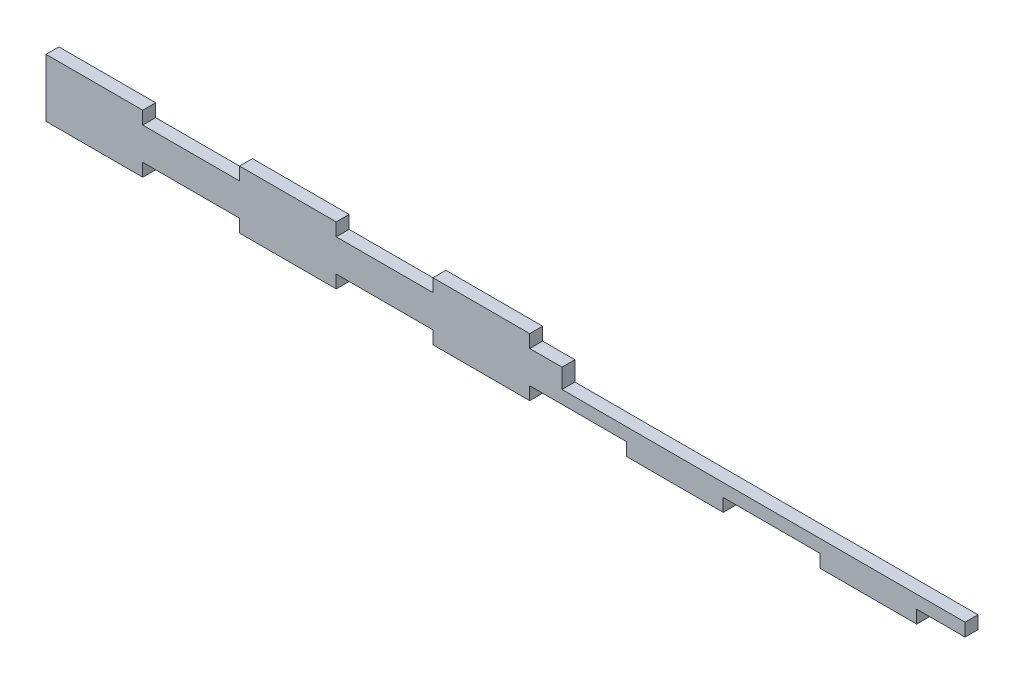
ISO-10303-21;
HEADER;
FILE_DESCRIPTION(('STEP AP214'),'2;1');
FILE_NAME('part.step','',(''),(''),'','','');
FILE_SCHEMA(('AUTOMOTIVE_DESIGN { 1 0 10303 214 1 1 1 1 }'));
ENDSEC;
DATA;
#1=APPLICATION_CONTEXT('core data for automotive mechanical design processes');
#2=APPLICATION_PROTOCOL_DEFINITION('international standard','automotive_design',2000,#1);
#3=PRODUCT_CONTEXT('',#1,'mechanical');
#4=PRODUCT('Part','Part','',(#3));
#5=PRODUCT_RELATED_PRODUCT_CATEGORY('part','',(#4));
#6=PRODUCT_DEFINITION_FORMATION('','',#4);
#7=PRODUCT_DEFINITION_CONTEXT('part definition',#1,'design');
#8=PRODUCT_DEFINITION('design','',#6,#7);
#9=PRODUCT_DEFINITION_SHAPE('','',#8);
#10=(LENGTH_UNIT() NAMED_UNIT(*) SI_UNIT(.MILLI.,.METRE.));
#11=(NAMED_UNIT(*) PLANE_ANGLE_UNIT() SI_UNIT($,.RADIAN.));
#12=(NAMED_UNIT(*) SI_UNIT($,.STERADIAN.) SOLID_ANGLE_UNIT());
#13=UNCERTAINTY_MEASURE_WITH_UNIT(LENGTH_MEASURE(1.E-05),#10,'distance_accuracy_value','');
#14=(GEOMETRIC_REPRESENTATION_CONTEXT(3) GLOBAL_UNCERTAINTY_ASSIGNED_CONTEXT((#13)) GLOBAL_UNIT_ASSIGNED_CONTEXT((#10,
#11,#12)) REPRESENTATION_CONTEXT('',''));
#15=CARTESIAN_POINT('',(0.,0.,0.));
#16=DIRECTION('',(0.,0.,1.));
#17=DIRECTION('',(1.,0.,0.));
#18=AXIS2_PLACEMENT_3D('',#15,#16,#17);
#19=CARTESIAN_POINT('',(15.,5.00000000000004,2.));
#20=DIRECTION('',(0.,-1.,0.));
#21=DIRECTION('',(1.,0.,0.));
#22=AXIS2_PLACEMENT_3D('',#19,#20,#21);
#23=PLANE('',#22);
#24=DIRECTION('',(-1.,0.,0.));
#25=VECTOR('',#24,1.);
#26=CARTESIAN_POINT('',(15.,5.00000000000004,2.));
#27=LINE('',#26,#25);
#28=CARTESIAN_POINT('',(25.,4.99999999999999,2.));
#29=VERTEX_POINT('',#28);
#30=CARTESIAN_POINT('',(15.,5.00000000000004,2.));
#31=VERTEX_POINT('',#30);
#32=EDGE_CURVE('E171',#29,#31,#27,.T.);
#33=ORIENTED_EDGE('',*,*,#32,.F.);
#34=DIRECTION('',(0.,0.,1.));
#35=VECTOR('',#34,1.);
#36=CARTESIAN_POINT('',(25.,5.00000000000001,-2.001));
#37=LINE('',#36,#35);
#38=CARTESIAN_POINT('',(25.,5.,-2.));
#39=VERTEX_POINT('',#38);
#40=EDGE_CURVE('E510',#39,#29,#37,.T.);
#41=ORIENTED_EDGE('',*,*,#40,.F.);
#42=DIRECTION('',(-1.,0.,0.));
#43=VECTOR('',#42,1.);
#44=CARTESIAN_POINT('',(15.,5.00000000000004,-2.));
#45=LINE('',#44,#43);
#46=CARTESIAN_POINT('',(15.,5.00000000000004,-2.));
#47=VERTEX_POINT('',#46);
#48=EDGE_CURVE('E282',#39,#47,#45,.T.);
#49=ORIENTED_EDGE('',*,*,#48,.T.);
#50=DIRECTION('',(0.,0.,-1.));
#51=VECTOR('',#50,1.);
#52=CARTESIAN_POINT('',(15.,5.00000000000004,2.));
#53=LINE('',#52,#51);
#54=EDGE_CURVE('E11',#31,#47,#53,.T.);
#55=ORIENTED_EDGE('',*,*,#54,.F.);
#56=EDGE_LOOP('',(#33,#41,#49,#55));
#57=FACE_BOUND('',#56,.T.);
#58=ADVANCED_FACE('F42',(#57),#23,.F.);
#59=CARTESIAN_POINT('',(15.,5.00000000000004,2.));
#60=DIRECTION('',(-1.,0.,0.));
#61=DIRECTION('',(0.,0.,1.));
#62=AXIS2_PLACEMENT_3D('',#59,#60,#61);
#63=PLANE('',#62);
#64=DIRECTION('',(0.,1.,0.));
#65=VECTOR('',#64,1.);
#66=CARTESIAN_POINT('',(15.,5.00000000000004,-2.));
#67=LINE('',#66,#65);
#68=CARTESIAN_POINT('',(15.,8.99999999999996,-2.));
#69=VERTEX_POINT('',#68);
#70=EDGE_CURVE('E284',#47,#69,#67,.T.);
#71=ORIENTED_EDGE('',*,*,#70,.T.);
#72=DIRECTION('',(0.,0.,-1.));
#73=VECTOR('',#72,1.);
#74=CARTESIAN_POINT('',(15.,8.99999999999996,2.));
#75=LINE('',#74,#73);
#76=CARTESIAN_POINT('',(15.,8.99999999999996,2.));
#77=VERTEX_POINT('',#76);
#78=EDGE_CURVE('E49',#77,#69,#75,.T.);
#79=ORIENTED_EDGE('',*,*,#78,.F.);
#80=DIRECTION('',(0.,1.,0.));
#81=VECTOR('',#80,1.);
#82=CARTESIAN_POINT('',(15.,5.00000000000004,2.));
#83=LINE('',#82,#81);
#84=EDGE_CURVE('E500',#31,#77,#83,.T.);
#85=ORIENTED_EDGE('',*,*,#84,.F.);
#86=ORIENTED_EDGE('',*,*,#54,.T.);
#87=EDGE_LOOP('',(#71,#79,#85,#86));
#88=FACE_BOUND('',#87,.T.);
#89=ADVANCED_FACE('F505',(#88),#63,.F.);
#90=CARTESIAN_POINT('',(-15.,8.99999999999996,2.));
#91=DIRECTION('',(0.,-1.,0.));
#92=DIRECTION('',(0.,0.,-1.));
#93=AXIS2_PLACEMENT_3D('',#90,#91,#92);
#94=PLANE('',#93);
#95=DIRECTION('',(-1.,0.,0.));
#96=VECTOR('',#95,1.);
#97=CARTESIAN_POINT('',(-15.,8.99999999999996,-2.));
#98=LINE('',#97,#96);
#99=CARTESIAN_POINT('',(-15.,8.99999999999996,-2.));
#100=VERTEX_POINT('',#99);
#101=EDGE_CURVE('E287',#69,#100,#98,.T.);
#102=ORIENTED_EDGE('',*,*,#101,.T.);
#103=DIRECTION('',(0.,0.,-1.));
#104=VECTOR('',#103,1.);
#105=CARTESIAN_POINT('',(-15.,8.99999999999996,2.));
#106=LINE('',#105,#104);
#107=CARTESIAN_POINT('',(-15.,8.99999999999996,2.));
#108=VERTEX_POINT('',#107);
#109=EDGE_CURVE('E411',#108,#100,#106,.T.);
#110=ORIENTED_EDGE('',*,*,#109,.F.);
#111=DIRECTION('',(-1.,0.,0.));
#112=VECTOR('',#111,1.);
#113=CARTESIAN_POINT('',(-15.,8.99999999999996,2.));
#114=LINE('',#113,#112);
#115=EDGE_CURVE('E420',#77,#108,#114,.T.);
#116=ORIENTED_EDGE('',*,*,#115,.F.);
#117=ORIENTED_EDGE('',*,*,#78,.T.);
#118=EDGE_LOOP('',(#102,#110,#116,#117));
#119=FACE_BOUND('',#118,.T.);
#120=ADVANCED_FACE('F418',(#119),#94,.F.);
#121=CARTESIAN_POINT('',(-15.,4.99999999999996,2.));
#122=DIRECTION('',(1.,0.,0.));
#123=DIRECTION('',(0.,0.,-1.));
#124=AXIS2_PLACEMENT_3D('',#121,#122,#123);
#125=PLANE('',#124);
#126=DIRECTION('',(0.,-1.,0.));
#127=VECTOR('',#126,1.);
#128=CARTESIAN_POINT('',(-15.,4.99999999999996,-2.));
#129=LINE('',#128,#127);
#130=CARTESIAN_POINT('',(-15.,4.99999999999996,-2.));
#131=VERTEX_POINT('',#130);
#132=EDGE_CURVE('E289',#100,#131,#129,.T.);
#133=ORIENTED_EDGE('',*,*,#132,.T.);
#134=DIRECTION('',(0.,0.,-1.));
#135=VECTOR('',#134,1.);
#136=CARTESIAN_POINT('',(-15.,4.99999999999996,2.));
#137=LINE('',#136,#135);
#138=CARTESIAN_POINT('',(-15.,4.99999999999996,2.));
#139=VERTEX_POINT('',#138);
#140=EDGE_CURVE('E408',#139,#131,#137,.T.);
#141=ORIENTED_EDGE('',*,*,#140,.F.);
#142=DIRECTION('',(0.,-1.,0.));
#143=VECTOR('',#142,1.);
#144=CARTESIAN_POINT('',(-15.,4.99999999999996,2.));
#145=LINE('',#144,#143);
#146=EDGE_CURVE('E441',#108,#139,#145,.T.);
#147=ORIENTED_EDGE('',*,*,#146,.F.);
#148=ORIENTED_EDGE('',*,*,#109,.T.);
#149=EDGE_LOOP('',(#133,#141,#147,#148));
#150=FACE_BOUND('',#149,.T.);
#151=ADVANCED_FACE('F432',(#150),#125,.F.);
#152=CARTESIAN_POINT('',(-45.,5.00000000000004,2.));
#153=DIRECTION('',(0.,-1.,0.));
#154=DIRECTION('',(1.,0.,0.));
#155=AXIS2_PLACEMENT_3D('',#152,#153,#154);
#156=PLANE('',#155);
#157=DIRECTION('',(-1.,0.,0.));
#158=VECTOR('',#157,1.);
#159=CARTESIAN_POINT('',(-45.,5.00000000000004,-2.));
#160=LINE('',#159,#158);
#161=CARTESIAN_POINT('',(-45.,5.00000000000004,-2.));
#162=VERTEX_POINT('',#161);
#163=EDGE_CURVE('E291',#131,#162,#160,.T.);
#164=ORIENTED_EDGE('',*,*,#163,.T.);
#165=DIRECTION('',(0.,0.,-1.));
#166=VECTOR('',#165,1.);
#167=CARTESIAN_POINT('',(-45.,5.00000000000004,2.));
#168=LINE('',#167,#166);
#169=CARTESIAN_POINT('',(-45.,5.00000000000004,2.));
#170=VERTEX_POINT('',#169);
#171=EDGE_CURVE('E405',#170,#162,#168,.T.);
#172=ORIENTED_EDGE('',*,*,#171,.F.);
#173=DIRECTION('',(-1.,0.,0.));
#174=VECTOR('',#173,1.);
#175=CARTESIAN_POINT('',(-45.,5.00000000000004,2.));
#176=LINE('',#175,#174);
#177=EDGE_CURVE('E438',#139,#170,#176,.T.);
#178=ORIENTED_EDGE('',*,*,#177,.F.);
#179=ORIENTED_EDGE('',*,*,#140,.T.);
#180=EDGE_LOOP('',(#164,#172,#178,#179));
#181=FACE_BOUND('',#180,.T.);
#182=ADVANCED_FACE('F436',(#181),#156,.F.);
#183=CARTESIAN_POINT('',(-45.,5.00000000000004,2.));
#184=DIRECTION('',(-1.,0.,0.));
#185=DIRECTION('',(0.,0.,1.));
#186=AXIS2_PLACEMENT_3D('',#183,#184,#185);
#187=PLANE('',#186);
#188=DIRECTION('',(0.,1.,0.));
#189=VECTOR('',#188,1.);
#190=CARTESIAN_POINT('',(-45.,5.00000000000004,-2.));
#191=LINE('',#190,#189);
#192=CARTESIAN_POINT('',(-45.,8.99999999999996,-2.));
#193=VERTEX_POINT('',#192);
#194=EDGE_CURVE('E293',#162,#193,#191,.T.);
#195=ORIENTED_EDGE('',*,*,#194,.T.);
#196=DIRECTION('',(0.,0.,-1.));
#197=VECTOR('',#196,1.);
#198=CARTESIAN_POINT('',(-45.,8.99999999999996,2.));
#199=LINE('',#198,#197);
#200=CARTESIAN_POINT('',(-45.,8.99999999999996,2.));
#201=VERTEX_POINT('',#200);
#202=EDGE_CURVE('E402',#201,#193,#199,.T.);
#203=ORIENTED_EDGE('',*,*,#202,.F.);
#204=DIRECTION('',(0.,1.,0.));
#205=VECTOR('',#204,1.);
#206=CARTESIAN_POINT('',(-45.,5.00000000000004,2.));
#207=LINE('',#206,#205);
#208=EDGE_CURVE('E440',#170,#201,#207,.T.);
#209=ORIENTED_EDGE('',*,*,#208,.F.);
#210=ORIENTED_EDGE('',*,*,#171,.T.);
#211=EDGE_LOOP('',(#195,#203,#209,#210));
#212=FACE_BOUND('',#211,.T.);
#213=ADVANCED_FACE('F568',(#212),#187,.F.);
#214=CARTESIAN_POINT('',(-75.,8.99999999999996,2.));
#215=DIRECTION('',(0.,-1.,0.));
#216=DIRECTION('',(0.,0.,-1.));
#217=AXIS2_PLACEMENT_3D('',#214,#215,#216);
#218=PLANE('',#217);
#219=DIRECTION('',(-1.,0.,0.));
#220=VECTOR('',#219,1.);
#221=CARTESIAN_POINT('',(-75.,8.99999999999996,-2.));
#222=LINE('',#221,#220);
#223=CARTESIAN_POINT('',(-75.,8.99999999999996,-2.));
#224=VERTEX_POINT('',#223);
#225=EDGE_CURVE('E295',#193,#224,#222,.T.);
#226=ORIENTED_EDGE('',*,*,#225,.T.);
#227=DIRECTION('',(0.,0.,-1.));
#228=VECTOR('',#227,1.);
#229=CARTESIAN_POINT('',(-75.,8.99999999999996,2.));
#230=LINE('',#229,#228);
#231=CARTESIAN_POINT('',(-75.,8.99999999999996,2.));
#232=VERTEX_POINT('',#231);
#233=EDGE_CURVE('E399',#232,#224,#230,.T.);
#234=ORIENTED_EDGE('',*,*,#233,.F.);
#235=DIRECTION('',(-1.,0.,0.));
#236=VECTOR('',#235,1.);
#237=CARTESIAN_POINT('',(-75.,8.99999999999996,2.));
#238=LINE('',#237,#236);
#239=EDGE_CURVE('E443',#201,#232,#238,.T.);
#240=ORIENTED_EDGE('',*,*,#239,.F.);
#241=ORIENTED_EDGE('',*,*,#202,.T.);
#242=EDGE_LOOP('',(#226,#234,#240,#241));
#243=FACE_BOUND('',#242,.T.);
#244=ADVANCED_FACE('F571',(#243),#218,.F.);
#245=CARTESIAN_POINT('',(-75.,4.99999999999996,2.));
#246=DIRECTION('',(1.,0.,0.));
#247=DIRECTION('',(0.,0.,-1.));
#248=AXIS2_PLACEMENT_3D('',#245,#246,#247);
#249=PLANE('',#248);
#250=DIRECTION('',(0.,-1.,0.));
#251=VECTOR('',#250,1.);
#252=CARTESIAN_POINT('',(-75.,4.99999999999996,-2.));
#253=LINE('',#252,#251);
#254=CARTESIAN_POINT('',(-75.,4.99999999999996,-2.));
#255=VERTEX_POINT('',#254);
#256=EDGE_CURVE('E297',#224,#255,#253,.T.);
#257=ORIENTED_EDGE('',*,*,#256,.T.);
#258=DIRECTION('',(0.,0.,-1.));
#259=VECTOR('',#258,1.);
#260=CARTESIAN_POINT('',(-75.,4.99999999999996,2.));
#261=LINE('',#260,#259);
#262=CARTESIAN_POINT('',(-75.,4.99999999999996,2.));
#263=VERTEX_POINT('',#262);
#264=EDGE_CURVE('E396',#263,#255,#261,.T.);
#265=ORIENTED_EDGE('',*,*,#264,.F.);
#266=DIRECTION('',(0.,-1.,0.));
#267=VECTOR('',#266,1.);
#268=CARTESIAN_POINT('',(-75.,4.99999999999996,2.));
#269=LINE('',#268,#267);
#270=EDGE_CURVE('E449',#232,#263,#269,.T.);
#271=ORIENTED_EDGE('',*,*,#270,.F.);
#272=ORIENTED_EDGE('',*,*,#233,.T.);
#273=EDGE_LOOP('',(#257,#265,#271,#272));
#274=FACE_BOUND('',#273,.T.);
#275=ADVANCED_FACE('F575',(#274),#249,.F.);
#276=CARTESIAN_POINT('',(-105.,5.00000000000004,2.));
#277=DIRECTION('',(0.,-1.,0.));
#278=DIRECTION('',(1.,0.,0.));
#279=AXIS2_PLACEMENT_3D('',#276,#277,#278);
#280=PLANE('',#279);
#281=DIRECTION('',(-1.,0.,0.));
#282=VECTOR('',#281,1.);
#283=CARTESIAN_POINT('',(-105.,5.00000000000004,-2.));
#284=LINE('',#283,#282);
#285=CARTESIAN_POINT('',(-105.,5.00000000000004,-2.));
#286=VERTEX_POINT('',#285);
#287=EDGE_CURVE('E299',#255,#286,#284,.T.);
#288=ORIENTED_EDGE('',*,*,#287,.T.);
#289=DIRECTION('',(0.,0.,-1.));
#290=VECTOR('',#289,1.);
#291=CARTESIAN_POINT('',(-105.,5.00000000000004,2.));
#292=LINE('',#291,#290);
#293=CARTESIAN_POINT('',(-105.,5.00000000000004,2.));
#294=VERTEX_POINT('',#293);
#295=EDGE_CURVE('E393',#294,#286,#292,.T.);
#296=ORIENTED_EDGE('',*,*,#295,.F.);
#297=DIRECTION('',(-1.,0.,0.));
#298=VECTOR('',#297,1.);
#299=CARTESIAN_POINT('',(-105.,5.00000000000004,2.));
#300=LINE('',#299,#298);
#301=EDGE_CURVE('E451',#263,#294,#300,.T.);
#302=ORIENTED_EDGE('',*,*,#301,.F.);
#303=ORIENTED_EDGE('',*,*,#264,.T.);
#304=EDGE_LOOP('',(#288,#296,#302,#303));
#305=FACE_BOUND('',#304,.T.);
#306=ADVANCED_FACE('F579',(#305),#280,.F.);
#307=CARTESIAN_POINT('',(-105.,5.00000000000004,2.));
#308=DIRECTION('',(-1.,0.,0.));
#309=DIRECTION('',(0.,0.,1.));
#310=AXIS2_PLACEMENT_3D('',#307,#308,#309);
#311=PLANE('',#310);
#312=DIRECTION('',(0.,1.,0.));
#313=VECTOR('',#312,1.);
#314=CARTESIAN_POINT('',(-105.,5.00000000000004,-2.));
#315=LINE('',#314,#313);
#316=CARTESIAN_POINT('',(-105.,8.99999999999996,-2.));
#317=VERTEX_POINT('',#316);
#318=EDGE_CURVE('E301',#286,#317,#315,.T.);
#319=ORIENTED_EDGE('',*,*,#318,.T.);
#320=DIRECTION('',(0.,0.,-1.));
#321=VECTOR('',#320,1.);
#322=CARTESIAN_POINT('',(-105.,8.99999999999996,2.));
#323=LINE('',#322,#321);
#324=CARTESIAN_POINT('',(-105.,8.99999999999996,2.));
#325=VERTEX_POINT('',#324);
#326=EDGE_CURVE('E390',#325,#317,#323,.T.);
#327=ORIENTED_EDGE('',*,*,#326,.F.);
#328=DIRECTION('',(0.,1.,0.));
#329=VECTOR('',#328,1.);
#330=CARTESIAN_POINT('',(-105.,5.00000000000004,2.));
#331=LINE('',#330,#329);
#332=EDGE_CURVE('E453',#294,#325,#331,.T.);
#333=ORIENTED_EDGE('',*,*,#332,.F.);
#334=ORIENTED_EDGE('',*,*,#295,.T.);
#335=EDGE_LOOP('',(#319,#327,#333,#334));
#336=FACE_BOUND('',#335,.T.);
#337=ADVANCED_FACE('F583',(#336),#311,.F.);
#338=CARTESIAN_POINT('',(-135.,8.99999999999996,2.));
#339=DIRECTION('',(0.,-1.,0.));
#340=DIRECTION('',(0.,0.,-1.));
#341=AXIS2_PLACEMENT_3D('',#338,#339,#340);
#342=PLANE('',#341);
#343=DIRECTION('',(-1.,0.,0.));
#344=VECTOR('',#343,1.);
#345=CARTESIAN_POINT('',(-135.,8.99999999999996,-2.));
#346=LINE('',#345,#344);
#347=CARTESIAN_POINT('',(-135.,8.99999999999996,-2.));
#348=VERTEX_POINT('',#347);
#349=EDGE_CURVE('E303',#317,#348,#346,.T.);
#350=ORIENTED_EDGE('',*,*,#349,.T.);
#351=DIRECTION('',(0.,0.,-1.));
#352=VECTOR('',#351,1.);
#353=CARTESIAN_POINT('',(-135.,8.99999999999996,2.));
#354=LINE('',#353,#352);
#355=CARTESIAN_POINT('',(-135.,8.99999999999996,2.));
#356=VERTEX_POINT('',#355);
#357=EDGE_CURVE('E387',#356,#348,#354,.T.);
#358=ORIENTED_EDGE('',*,*,#357,.F.);
#359=DIRECTION('',(-1.,0.,0.));
#360=VECTOR('',#359,1.);
#361=CARTESIAN_POINT('',(-135.,8.99999999999996,2.));
#362=LINE('',#361,#360);
#363=EDGE_CURVE('E455',#325,#356,#362,.T.);
#364=ORIENTED_EDGE('',*,*,#363,.F.);
#365=ORIENTED_EDGE('',*,*,#326,.T.);
#366=EDGE_LOOP('',(#350,#358,#364,#365));
#367=FACE_BOUND('',#366,.T.);
#368=ADVANCED_FACE('F587',(#367),#342,.F.);
#369=CARTESIAN_POINT('',(-135.,-5.00000000000004,2.));
#370=DIRECTION('',(1.,0.,0.));
#371=DIRECTION('',(0.,0.,-1.));
#372=AXIS2_PLACEMENT_3D('',#369,#370,#371);
#373=PLANE('',#372);
#374=DIRECTION('',(0.,-1.,0.));
#375=VECTOR('',#374,1.);
#376=CARTESIAN_POINT('',(-135.,-5.00000000000004,-2.));
#377=LINE('',#376,#375);
#378=CARTESIAN_POINT('',(-135.,-8.99999999999996,-2.));
#379=VERTEX_POINT('',#378);
#380=EDGE_CURVE('E306',#348,#379,#377,.T.);
#381=ORIENTED_EDGE('',*,*,#380,.T.);
#382=DIRECTION('',(0.,0.,-1.));
#383=VECTOR('',#382,1.);
#384=CARTESIAN_POINT('',(-135.,-8.99999999999996,2.));
#385=LINE('',#384,#383);
#386=CARTESIAN_POINT('',(-135.,-8.99999999999996,2.));
#387=VERTEX_POINT('',#386);
#388=EDGE_CURVE('E384',#387,#379,#385,.T.);
#389=ORIENTED_EDGE('',*,*,#388,.F.);
#390=DIRECTION('',(0.,-1.,0.));
#391=VECTOR('',#390,1.);
#392=CARTESIAN_POINT('',(-135.,4.99999999999996,2.));
#393=LINE('',#392,#391);
#394=EDGE_CURVE('E457',#356,#387,#393,.T.);
#395=ORIENTED_EDGE('',*,*,#394,.F.);
#396=ORIENTED_EDGE('',*,*,#357,.T.);
#397=EDGE_LOOP('',(#381,#389,#395,#396));
#398=FACE_BOUND('',#397,.T.);
#399=ADVANCED_FACE('F591',(#398),#373,.F.);
#400=CARTESIAN_POINT('',(-135.,-8.99999999999996,2.));
#401=DIRECTION('',(0.,1.,0.));
#402=DIRECTION('',(0.,0.,1.));
#403=AXIS2_PLACEMENT_3D('',#400,#401,#402);
#404=PLANE('',#403);
#405=DIRECTION('',(1.,0.,0.));
#406=VECTOR('',#405,1.);
#407=CARTESIAN_POINT('',(-135.,-8.99999999999996,-2.));
#408=LINE('',#407,#406);
#409=CARTESIAN_POINT('',(-105.,-8.99999999999996,-2.));
#410=VERTEX_POINT('',#409);
#411=EDGE_CURVE('E308',#379,#410,#408,.T.);
#412=ORIENTED_EDGE('',*,*,#411,.T.);
#413=DIRECTION('',(0.,0.,-1.));
#414=VECTOR('',#413,1.);
#415=CARTESIAN_POINT('',(-105.,-8.99999999999996,2.));
#416=LINE('',#415,#414);
#417=CARTESIAN_POINT('',(-105.,-8.99999999999996,2.));
#418=VERTEX_POINT('',#417);
#419=EDGE_CURVE('E381',#418,#410,#416,.T.);
#420=ORIENTED_EDGE('',*,*,#419,.F.);
#421=DIRECTION('',(1.,0.,0.));
#422=VECTOR('',#421,1.);
#423=CARTESIAN_POINT('',(-135.,-8.99999999999996,2.));
#424=LINE('',#423,#422);
#425=EDGE_CURVE('E459',#387,#418,#424,.T.);
#426=ORIENTED_EDGE('',*,*,#425,.F.);
#427=ORIENTED_EDGE('',*,*,#388,.T.);
#428=EDGE_LOOP('',(#412,#420,#426,#427));
#429=FACE_BOUND('',#428,.T.);
#430=ADVANCED_FACE('F595',(#429),#404,.F.);
#431=CARTESIAN_POINT('',(-105.,-5.00000000000004,2.));
#432=DIRECTION('',(-1.,0.,0.));
#433=DIRECTION('',(0.,0.,1.));
#434=AXIS2_PLACEMENT_3D('',#431,#432,#433);
#435=PLANE('',#434);
#436=DIRECTION('',(0.,1.,0.));
#437=VECTOR('',#436,1.);
#438=CARTESIAN_POINT('',(-105.,-5.00000000000004,-2.));
#439=LINE('',#438,#437);
#440=CARTESIAN_POINT('',(-105.,-5.00000000000004,-2.));
#441=VERTEX_POINT('',#440);
#442=EDGE_CURVE('E310',#410,#441,#439,.T.);
#443=ORIENTED_EDGE('',*,*,#442,.T.);
#444=DIRECTION('',(0.,0.,-1.));
#445=VECTOR('',#444,1.);
#446=CARTESIAN_POINT('',(-105.,-5.00000000000004,2.));
#447=LINE('',#446,#445);
#448=CARTESIAN_POINT('',(-105.,-5.00000000000004,2.));
#449=VERTEX_POINT('',#448);
#450=EDGE_CURVE('E378',#449,#441,#447,.T.);
#451=ORIENTED_EDGE('',*,*,#450,.F.);
#452=DIRECTION('',(0.,1.,0.));
#453=VECTOR('',#452,1.);
#454=CARTESIAN_POINT('',(-105.,-5.00000000000004,2.));
#455=LINE('',#454,#453);
#456=EDGE_CURVE('E461',#418,#449,#455,.T.);
#457=ORIENTED_EDGE('',*,*,#456,.F.);
#458=ORIENTED_EDGE('',*,*,#419,.T.);
#459=EDGE_LOOP('',(#443,#451,#457,#458));
#460=FACE_BOUND('',#459,.T.);
#461=ADVANCED_FACE('F599',(#460),#435,.F.);
#462=CARTESIAN_POINT('',(-105.,-5.00000000000004,2.));
#463=DIRECTION('',(0.,1.,0.));
#464=DIRECTION('',(0.,0.,1.));
#465=AXIS2_PLACEMENT_3D('',#462,#463,#464);
#466=PLANE('',#465);
#467=DIRECTION('',(1.,0.,0.));
#468=VECTOR('',#467,1.);
#469=CARTESIAN_POINT('',(-105.,-5.00000000000004,-2.));
#470=LINE('',#469,#468);
#471=CARTESIAN_POINT('',(-75.,-5.00000000000004,-2.));
#472=VERTEX_POINT('',#471);
#473=EDGE_CURVE('E312',#441,#472,#470,.T.);
#474=ORIENTED_EDGE('',*,*,#473,.T.);
#475=DIRECTION('',(0.,0.,-1.));
#476=VECTOR('',#475,1.);
#477=CARTESIAN_POINT('',(-75.,-5.00000000000004,2.));
#478=LINE('',#477,#476);
#479=CARTESIAN_POINT('',(-75.,-5.00000000000004,2.));
#480=VERTEX_POINT('',#479);
#481=EDGE_CURVE('E375',#480,#472,#478,.T.);
#482=ORIENTED_EDGE('',*,*,#481,.F.);
#483=DIRECTION('',(1.,0.,0.));
#484=VECTOR('',#483,1.);
#485=CARTESIAN_POINT('',(-105.,-5.00000000000004,2.));
#486=LINE('',#485,#484);
#487=EDGE_CURVE('E463',#449,#480,#486,.T.);
#488=ORIENTED_EDGE('',*,*,#487,.F.);
#489=ORIENTED_EDGE('',*,*,#450,.T.);
#490=EDGE_LOOP('',(#474,#482,#488,#489));
#491=FACE_BOUND('',#490,.T.);
#492=ADVANCED_FACE('F603',(#491),#466,.F.);
#493=CARTESIAN_POINT('',(-75.,-5.00000000000004,2.));
#494=DIRECTION('',(1.,0.,0.));
#495=DIRECTION('',(0.,0.,-1.));
#496=AXIS2_PLACEMENT_3D('',#493,#494,#495);
#497=PLANE('',#496);
#498=DIRECTION('',(0.,-1.,0.));
#499=VECTOR('',#498,1.);
#500=CARTESIAN_POINT('',(-75.,-5.00000000000004,-2.));
#501=LINE('',#500,#499);
#502=CARTESIAN_POINT('',(-75.,-8.99999999999996,-2.));
#503=VERTEX_POINT('',#502);
#504=EDGE_CURVE('E314',#472,#503,#501,.T.);
#505=ORIENTED_EDGE('',*,*,#504,.T.);
#506=DIRECTION('',(0.,0.,-1.));
#507=VECTOR('',#506,1.);
#508=CARTESIAN_POINT('',(-75.,-8.99999999999996,2.));
#509=LINE('',#508,#507);
#510=CARTESIAN_POINT('',(-75.,-8.99999999999996,2.));
#511=VERTEX_POINT('',#510);
#512=EDGE_CURVE('E372',#511,#503,#509,.T.);
#513=ORIENTED_EDGE('',*,*,#512,.F.);
#514=DIRECTION('',(0.,-1.,0.));
#515=VECTOR('',#514,1.);
#516=CARTESIAN_POINT('',(-75.,-5.00000000000004,2.));
#517=LINE('',#516,#515);
#518=EDGE_CURVE('E465',#480,#511,#517,.T.);
#519=ORIENTED_EDGE('',*,*,#518,.F.);
#520=ORIENTED_EDGE('',*,*,#481,.T.);
#521=EDGE_LOOP('',(#505,#513,#519,#520));
#522=FACE_BOUND('',#521,.T.);
#523=ADVANCED_FACE('F607',(#522),#497,.F.);
#524=CARTESIAN_POINT('',(-75.,-8.99999999999996,2.));
#525=DIRECTION('',(0.,1.,0.));
#526=DIRECTION('',(0.,0.,1.));
#527=AXIS2_PLACEMENT_3D('',#524,#525,#526);
#528=PLANE('',#527);
#529=DIRECTION('',(1.,0.,0.));
#530=VECTOR('',#529,1.);
#531=CARTESIAN_POINT('',(-75.,-8.99999999999996,-2.));
#532=LINE('',#531,#530);
#533=CARTESIAN_POINT('',(-45.,-8.99999999999996,-2.));
#534=VERTEX_POINT('',#533);
#535=EDGE_CURVE('E316',#503,#534,#532,.T.);
#536=ORIENTED_EDGE('',*,*,#535,.T.);
#537=DIRECTION('',(0.,0.,-1.));
#538=VECTOR('',#537,1.);
#539=CARTESIAN_POINT('',(-45.,-8.99999999999996,2.));
#540=LINE('',#539,#538);
#541=CARTESIAN_POINT('',(-45.,-8.99999999999996,2.));
#542=VERTEX_POINT('',#541);
#543=EDGE_CURVE('E369',#542,#534,#540,.T.);
#544=ORIENTED_EDGE('',*,*,#543,.F.);
#545=DIRECTION('',(1.,0.,0.));
#546=VECTOR('',#545,1.);
#547=CARTESIAN_POINT('',(-75.,-8.99999999999996,2.));
#548=LINE('',#547,#546);
#549=EDGE_CURVE('E467',#511,#542,#548,.T.);
#550=ORIENTED_EDGE('',*,*,#549,.F.);
#551=ORIENTED_EDGE('',*,*,#512,.T.);
#552=EDGE_LOOP('',(#536,#544,#550,#551));
#553=FACE_BOUND('',#552,.T.);
#554=ADVANCED_FACE('F611',(#553),#528,.F.);
#555=CARTESIAN_POINT('',(-45.,-5.00000000000004,2.));
#556=DIRECTION('',(-1.,0.,0.));
#557=DIRECTION('',(0.,0.,1.));
#558=AXIS2_PLACEMENT_3D('',#555,#556,#557);
#559=PLANE('',#558);
#560=DIRECTION('',(0.,1.,0.));
#561=VECTOR('',#560,1.);
#562=CARTESIAN_POINT('',(-45.,-5.00000000000004,-2.));
#563=LINE('',#562,#561);
#564=CARTESIAN_POINT('',(-45.,-5.00000000000004,-2.));
#565=VERTEX_POINT('',#564);
#566=EDGE_CURVE('E318',#534,#565,#563,.T.);
#567=ORIENTED_EDGE('',*,*,#566,.T.);
#568=DIRECTION('',(0.,0.,-1.));
#569=VECTOR('',#568,1.);
#570=CARTESIAN_POINT('',(-45.,-5.00000000000004,2.));
#571=LINE('',#570,#569);
#572=CARTESIAN_POINT('',(-45.,-5.00000000000004,2.));
#573=VERTEX_POINT('',#572);
#574=EDGE_CURVE('E366',#573,#565,#571,.T.);
#575=ORIENTED_EDGE('',*,*,#574,.F.);
#576=DIRECTION('',(0.,1.,0.));
#577=VECTOR('',#576,1.);
#578=CARTESIAN_POINT('',(-45.,-5.00000000000004,2.));
#579=LINE('',#578,#577);
#580=EDGE_CURVE('E469',#542,#573,#579,.T.);
#581=ORIENTED_EDGE('',*,*,#580,.F.);
#582=ORIENTED_EDGE('',*,*,#543,.T.);
#583=EDGE_LOOP('',(#567,#575,#581,#582));
#584=FACE_BOUND('',#583,.T.);
#585=ADVANCED_FACE('F615',(#584),#559,.F.);
#586=CARTESIAN_POINT('',(-45.,-5.00000000000004,2.));
#587=DIRECTION('',(0.,1.,0.));
#588=DIRECTION('',(0.,0.,1.));
#589=AXIS2_PLACEMENT_3D('',#586,#587,#588);
#590=PLANE('',#589);
#591=DIRECTION('',(1.,0.,0.));
#592=VECTOR('',#591,1.);
#593=CARTESIAN_POINT('',(-45.,-5.00000000000004,-2.));
#594=LINE('',#593,#592);
#595=CARTESIAN_POINT('',(-15.,-5.00000000000004,-2.));
#596=VERTEX_POINT('',#595);
#597=EDGE_CURVE('E320',#565,#596,#594,.T.);
#598=ORIENTED_EDGE('',*,*,#597,.T.);
#599=DIRECTION('',(0.,0.,-1.));
#600=VECTOR('',#599,1.);
#601=CARTESIAN_POINT('',(-15.,-5.00000000000004,2.));
#602=LINE('',#601,#600);
#603=CARTESIAN_POINT('',(-15.,-5.00000000000004,2.));
#604=VERTEX_POINT('',#603);
#605=EDGE_CURVE('E363',#604,#596,#602,.T.);
#606=ORIENTED_EDGE('',*,*,#605,.F.);
#607=DIRECTION('',(1.,0.,0.));
#608=VECTOR('',#607,1.);
#609=CARTESIAN_POINT('',(-45.,-5.00000000000004,2.));
#610=LINE('',#609,#608);
#611=EDGE_CURVE('E471',#573,#604,#610,.T.);
#612=ORIENTED_EDGE('',*,*,#611,.F.);
#613=ORIENTED_EDGE('',*,*,#574,.T.);
#614=EDGE_LOOP('',(#598,#606,#612,#613));
#615=FACE_BOUND('',#614,.T.);
#616=ADVANCED_FACE('F619',(#615),#590,.F.);
#617=CARTESIAN_POINT('',(-15.,-5.00000000000004,2.));
#618=DIRECTION('',(1.,0.,0.));
#619=DIRECTION('',(0.,0.,-1.));
#620=AXIS2_PLACEMENT_3D('',#617,#618,#619);
#621=PLANE('',#620);
#622=DIRECTION('',(0.,-1.,0.));
#623=VECTOR('',#622,1.);
#624=CARTESIAN_POINT('',(-15.,-5.00000000000004,-2.));
#625=LINE('',#624,#623);
#626=CARTESIAN_POINT('',(-15.,-8.99999999999996,-2.));
#627=VERTEX_POINT('',#626);
#628=EDGE_CURVE('E322',#596,#627,#625,.T.);
#629=ORIENTED_EDGE('',*,*,#628,.T.);
#630=DIRECTION('',(0.,0.,-1.));
#631=VECTOR('',#630,1.);
#632=CARTESIAN_POINT('',(-15.,-8.99999999999996,2.));
#633=LINE('',#632,#631);
#634=CARTESIAN_POINT('',(-15.,-8.99999999999996,2.));
#635=VERTEX_POINT('',#634);
#636=EDGE_CURVE('E360',#635,#627,#633,.T.);
#637=ORIENTED_EDGE('',*,*,#636,.F.);
#638=DIRECTION('',(0.,-1.,0.));
#639=VECTOR('',#638,1.);
#640=CARTESIAN_POINT('',(-15.,-5.00000000000004,2.));
#641=LINE('',#640,#639);
#642=EDGE_CURVE('E473',#604,#635,#641,.T.);
#643=ORIENTED_EDGE('',*,*,#642,.F.);
#644=ORIENTED_EDGE('',*,*,#605,.T.);
#645=EDGE_LOOP('',(#629,#637,#643,#644));
#646=FACE_BOUND('',#645,.T.);
#647=ADVANCED_FACE('F623',(#646),#621,.F.);
#648=CARTESIAN_POINT('',(-15.,-8.99999999999996,2.));
#649=DIRECTION('',(0.,1.,0.));
#650=DIRECTION('',(0.,0.,1.));
#651=AXIS2_PLACEMENT_3D('',#648,#649,#650);
#652=PLANE('',#651);
#653=DIRECTION('',(1.,0.,0.));
#654=VECTOR('',#653,1.);
#655=CARTESIAN_POINT('',(-15.,-8.99999999999996,-2.));
#656=LINE('',#655,#654);
#657=CARTESIAN_POINT('',(15.,-8.99999999999996,-2.));
#658=VERTEX_POINT('',#657);
#659=EDGE_CURVE('E324',#627,#658,#656,.T.);
#660=ORIENTED_EDGE('',*,*,#659,.T.);
#661=DIRECTION('',(0.,0.,-1.));
#662=VECTOR('',#661,1.);
#663=CARTESIAN_POINT('',(15.,-8.99999999999996,2.));
#664=LINE('',#663,#662);
#665=CARTESIAN_POINT('',(15.,-8.99999999999996,2.));
#666=VERTEX_POINT('',#665);
#667=EDGE_CURVE('E357',#666,#658,#664,.T.);
#668=ORIENTED_EDGE('',*,*,#667,.F.);
#669=DIRECTION('',(1.,0.,0.));
#670=VECTOR('',#669,1.);
#671=CARTESIAN_POINT('',(-15.,-8.99999999999996,2.));
#672=LINE('',#671,#670);
#673=EDGE_CURVE('E475',#635,#666,#672,.T.);
#674=ORIENTED_EDGE('',*,*,#673,.F.);
#675=ORIENTED_EDGE('',*,*,#636,.T.);
#676=EDGE_LOOP('',(#660,#668,#674,#675));
#677=FACE_BOUND('',#676,.T.);
#678=ADVANCED_FACE('F627',(#677),#652,.F.);
#679=CARTESIAN_POINT('',(15.,-5.00000000000004,2.));
#680=DIRECTION('',(-1.,0.,0.));
#681=DIRECTION('',(0.,0.,1.));
#682=AXIS2_PLACEMENT_3D('',#679,#680,#681);
#683=PLANE('',#682);
#684=DIRECTION('',(0.,1.,0.));
#685=VECTOR('',#684,1.);
#686=CARTESIAN_POINT('',(15.,-5.00000000000004,-2.));
#687=LINE('',#686,#685);
#688=CARTESIAN_POINT('',(15.,-5.00000000000004,-2.));
#689=VERTEX_POINT('',#688);
#690=EDGE_CURVE('E326',#658,#689,#687,.T.);
#691=ORIENTED_EDGE('',*,*,#690,.T.);
#692=DIRECTION('',(0.,0.,-1.));
#693=VECTOR('',#692,1.);
#694=CARTESIAN_POINT('',(15.,-5.00000000000004,2.));
#695=LINE('',#694,#693);
#696=CARTESIAN_POINT('',(15.,-5.00000000000004,2.));
#697=VERTEX_POINT('',#696);
#698=EDGE_CURVE('E354',#697,#689,#695,.T.);
#699=ORIENTED_EDGE('',*,*,#698,.F.);
#700=DIRECTION('',(0.,1.,0.));
#701=VECTOR('',#700,1.);
#702=CARTESIAN_POINT('',(15.,-5.00000000000004,2.));
#703=LINE('',#702,#701);
#704=EDGE_CURVE('E477',#666,#697,#703,.T.);
#705=ORIENTED_EDGE('',*,*,#704,.F.);
#706=ORIENTED_EDGE('',*,*,#667,.T.);
#707=EDGE_LOOP('',(#691,#699,#705,#706));
#708=FACE_BOUND('',#707,.T.);
#709=ADVANCED_FACE('F631',(#708),#683,.F.);
#710=CARTESIAN_POINT('',(15.,-5.00000000000004,2.));
#711=DIRECTION('',(0.,1.,0.));
#712=DIRECTION('',(0.,0.,1.));
#713=AXIS2_PLACEMENT_3D('',#710,#711,#712);
#714=PLANE('',#713);
#715=DIRECTION('',(1.,0.,0.));
#716=VECTOR('',#715,1.);
#717=CARTESIAN_POINT('',(15.,-5.00000000000004,-2.));
#718=LINE('',#717,#716);
#719=CARTESIAN_POINT('',(45.,-5.00000000000004,-2.));
#720=VERTEX_POINT('',#719);
#721=EDGE_CURVE('E328',#689,#720,#718,.T.);
#722=ORIENTED_EDGE('',*,*,#721,.T.);
#723=DIRECTION('',(0.,0.,-1.));
#724=VECTOR('',#723,1.);
#725=CARTESIAN_POINT('',(45.,-5.00000000000004,2.));
#726=LINE('',#725,#724);
#727=CARTESIAN_POINT('',(45.,-5.00000000000004,2.));
#728=VERTEX_POINT('',#727);
#729=EDGE_CURVE('E351',#728,#720,#726,.T.);
#730=ORIENTED_EDGE('',*,*,#729,.F.);
#731=DIRECTION('',(1.,0.,0.));
#732=VECTOR('',#731,1.);
#733=CARTESIAN_POINT('',(15.,-5.00000000000004,2.));
#734=LINE('',#733,#732);
#735=EDGE_CURVE('E479',#697,#728,#734,.T.);
#736=ORIENTED_EDGE('',*,*,#735,.F.);
#737=ORIENTED_EDGE('',*,*,#698,.T.);
#738=EDGE_LOOP('',(#722,#730,#736,#737));
#739=FACE_BOUND('',#738,.T.);
#740=ADVANCED_FACE('F635',(#739),#714,.F.);
#741=CARTESIAN_POINT('',(45.,-5.00000000000004,2.));
#742=DIRECTION('',(1.,0.,0.));
#743=DIRECTION('',(0.,0.,-1.));
#744=AXIS2_PLACEMENT_3D('',#741,#742,#743);
#745=PLANE('',#744);
#746=DIRECTION('',(0.,-1.,0.));
#747=VECTOR('',#746,1.);
#748=CARTESIAN_POINT('',(45.,-5.00000000000004,-2.));
#749=LINE('',#748,#747);
#750=CARTESIAN_POINT('',(45.,-8.99999999999996,-2.));
#751=VERTEX_POINT('',#750);
#752=EDGE_CURVE('E330',#720,#751,#749,.T.);
#753=ORIENTED_EDGE('',*,*,#752,.T.);
#754=DIRECTION('',(0.,0.,-1.));
#755=VECTOR('',#754,1.);
#756=CARTESIAN_POINT('',(45.,-8.99999999999996,2.));
#757=LINE('',#756,#755);
#758=CARTESIAN_POINT('',(45.,-8.99999999999996,2.));
#759=VERTEX_POINT('',#758);
#760=EDGE_CURVE('E348',#759,#751,#757,.T.);
#761=ORIENTED_EDGE('',*,*,#760,.F.);
#762=DIRECTION('',(0.,-1.,0.));
#763=VECTOR('',#762,1.);
#764=CARTESIAN_POINT('',(45.,-5.00000000000004,2.));
#765=LINE('',#764,#763);
#766=EDGE_CURVE('E481',#728,#759,#765,.T.);
#767=ORIENTED_EDGE('',*,*,#766,.F.);
#768=ORIENTED_EDGE('',*,*,#729,.T.);
#769=EDGE_LOOP('',(#753,#761,#767,#768));
#770=FACE_BOUND('',#769,.T.);
#771=ADVANCED_FACE('F639',(#770),#745,.F.);
#772=CARTESIAN_POINT('',(45.,-8.99999999999996,2.));
#773=DIRECTION('',(0.,1.,0.));
#774=DIRECTION('',(0.,0.,1.));
#775=AXIS2_PLACEMENT_3D('',#772,#773,#774);
#776=PLANE('',#775);
#777=DIRECTION('',(1.,0.,0.));
#778=VECTOR('',#777,1.);
#779=CARTESIAN_POINT('',(45.,-8.99999999999996,-2.));
#780=LINE('',#779,#778);
#781=CARTESIAN_POINT('',(75.,-8.99999999999996,-2.));
#782=VERTEX_POINT('',#781);
#783=EDGE_CURVE('E332',#751,#782,#780,.T.);
#784=ORIENTED_EDGE('',*,*,#783,.T.);
#785=DIRECTION('',(0.,0.,-1.));
#786=VECTOR('',#785,1.);
#787=CARTESIAN_POINT('',(75.,-8.99999999999996,2.));
#788=LINE('',#787,#786);
#789=CARTESIAN_POINT('',(75.,-8.99999999999996,2.));
#790=VERTEX_POINT('',#789);
#791=EDGE_CURVE('E345',#790,#782,#788,.T.);
#792=ORIENTED_EDGE('',*,*,#791,.F.);
#793=DIRECTION('',(1.,0.,0.));
#794=VECTOR('',#793,1.);
#795=CARTESIAN_POINT('',(45.,-8.99999999999996,2.));
#796=LINE('',#795,#794);
#797=EDGE_CURVE('E483',#759,#790,#796,.T.);
#798=ORIENTED_EDGE('',*,*,#797,.F.);
#799=ORIENTED_EDGE('',*,*,#760,.T.);
#800=EDGE_LOOP('',(#784,#792,#798,#799));
#801=FACE_BOUND('',#800,.T.);
#802=ADVANCED_FACE('F489',(#801),#776,.F.);
#803=CARTESIAN_POINT('',(75.,-5.00000000000004,2.));
#804=DIRECTION('',(-1.,0.,0.));
#805=DIRECTION('',(0.,0.,1.));
#806=AXIS2_PLACEMENT_3D('',#803,#804,#805);
#807=PLANE('',#806);
#808=DIRECTION('',(0.,1.,0.));
#809=VECTOR('',#808,1.);
#810=CARTESIAN_POINT('',(75.,-5.00000000000004,-2.));
#811=LINE('',#810,#809);
#812=CARTESIAN_POINT('',(75.,-5.00000000000004,-2.));
#813=VERTEX_POINT('',#812);
#814=EDGE_CURVE('E334',#782,#813,#811,.T.);
#815=ORIENTED_EDGE('',*,*,#814,.T.);
#816=DIRECTION('',(0.,0.,-1.));
#817=VECTOR('',#816,1.);
#818=CARTESIAN_POINT('',(75.,-5.00000000000004,2.));
#819=LINE('',#818,#817);
#820=CARTESIAN_POINT('',(75.,-5.00000000000004,2.));
#821=VERTEX_POINT('',#820);
#822=EDGE_CURVE('E270',#821,#813,#819,.T.);
#823=ORIENTED_EDGE('',*,*,#822,.F.);
#824=DIRECTION('',(0.,1.,0.));
#825=VECTOR('',#824,1.);
#826=CARTESIAN_POINT('',(75.,-5.00000000000004,2.));
#827=LINE('',#826,#825);
#828=EDGE_CURVE('E258',#790,#821,#827,.T.);
#829=ORIENTED_EDGE('',*,*,#828,.F.);
#830=ORIENTED_EDGE('',*,*,#791,.T.);
#831=EDGE_LOOP('',(#815,#823,#829,#830));
#832=FACE_BOUND('',#831,.T.);
#833=ADVANCED_FACE('F493',(#832),#807,.F.);
#834=CARTESIAN_POINT('',(75.,-5.00000000000004,2.));
#835=DIRECTION('',(0.,1.,0.));
#836=DIRECTION('',(0.,0.,1.));
#837=AXIS2_PLACEMENT_3D('',#834,#835,#836);
#838=PLANE('',#837);
#839=DIRECTION('',(1.,0.,0.));
#840=VECTOR('',#839,1.);
#841=CARTESIAN_POINT('',(75.,-5.00000000000004,-2.));
#842=LINE('',#841,#840);
#843=CARTESIAN_POINT('',(105.,-5.00000000000004,-2.));
#844=VERTEX_POINT('',#843);
#845=EDGE_CURVE('E267',#813,#844,#842,.T.);
#846=ORIENTED_EDGE('',*,*,#845,.T.);
#847=DIRECTION('',(0.,0.,-1.));
#848=VECTOR('',#847,1.);
#849=CARTESIAN_POINT('',(105.,-5.00000000000004,2.));
#850=LINE('',#849,#848);
#851=CARTESIAN_POINT('',(105.,-5.00000000000004,2.));
#852=VERTEX_POINT('',#851);
#853=EDGE_CURVE('E264',#852,#844,#850,.T.);
#854=ORIENTED_EDGE('',*,*,#853,.F.);
#855=DIRECTION('',(1.,0.,0.));
#856=VECTOR('',#855,1.);
#857=CARTESIAN_POINT('',(75.,-5.00000000000004,2.));
#858=LINE('',#857,#856);
#859=EDGE_CURVE('E250',#821,#852,#858,.T.);
#860=ORIENTED_EDGE('',*,*,#859,.F.);
#861=ORIENTED_EDGE('',*,*,#822,.T.);
#862=EDGE_LOOP('',(#846,#854,#860,#861));
#863=FACE_BOUND('',#862,.T.);
#864=ADVANCED_FACE('F265',(#863),#838,.F.);
#865=CARTESIAN_POINT('',(105.,-5.00000000000004,2.));
#866=DIRECTION('',(1.,0.,0.));
#867=DIRECTION('',(0.,0.,-1.));
#868=AXIS2_PLACEMENT_3D('',#865,#866,#867);
#869=PLANE('',#868);
#870=DIRECTION('',(0.,-1.,0.));
#871=VECTOR('',#870,1.);
#872=CARTESIAN_POINT('',(105.,-5.00000000000004,-2.));
#873=LINE('',#872,#871);
#874=CARTESIAN_POINT('',(105.,-8.99999999999996,-2.));
#875=VERTEX_POINT('',#874);
#876=EDGE_CURVE('E337',#844,#875,#873,.T.);
#877=ORIENTED_EDGE('',*,*,#876,.T.);
#878=DIRECTION('',(0.,0.,-1.));
#879=VECTOR('',#878,1.);
#880=CARTESIAN_POINT('',(105.,-8.99999999999996,2.));
#881=LINE('',#880,#879);
#882=CARTESIAN_POINT('',(105.,-8.99999999999996,2.));
#883=VERTEX_POINT('',#882);
#884=EDGE_CURVE('E271',#883,#875,#881,.T.);
#885=ORIENTED_EDGE('',*,*,#884,.F.);
#886=DIRECTION('',(0.,-1.,0.));
#887=VECTOR('',#886,1.);
#888=CARTESIAN_POINT('',(105.,-5.00000000000004,2.));
#889=LINE('',#888,#887);
#890=EDGE_CURVE('E255',#852,#883,#889,.T.);
#891=ORIENTED_EDGE('',*,*,#890,.F.);
#892=ORIENTED_EDGE('',*,*,#853,.T.);
#893=EDGE_LOOP('',(#877,#885,#891,#892));
#894=FACE_BOUND('',#893,.T.);
#895=ADVANCED_FACE('F273',(#894),#869,.F.);
#896=CARTESIAN_POINT('',(105.,-8.99999999999996,2.));
#897=DIRECTION('',(0.,1.,0.));
#898=DIRECTION('',(0.,0.,1.));
#899=AXIS2_PLACEMENT_3D('',#896,#897,#898);
#900=PLANE('',#899);
#901=DIRECTION('',(1.,0.,0.));
#902=VECTOR('',#901,1.);
#903=CARTESIAN_POINT('',(105.,-8.99999999999996,-2.));
#904=LINE('',#903,#902);
#905=CARTESIAN_POINT('',(135.,-8.99999999999996,-2.));
#906=VERTEX_POINT('',#905);
#907=EDGE_CURVE('E339',#875,#906,#904,.T.);
#908=ORIENTED_EDGE('',*,*,#907,.T.);
#909=DIRECTION('',(0.,0.,-1.));
#910=VECTOR('',#909,1.);
#911=CARTESIAN_POINT('',(135.,-8.99999999999996,2.));
#912=LINE('',#911,#910);
#913=CARTESIAN_POINT('',(135.,-8.99999999999996,2.));
#914=VERTEX_POINT('',#913);
#915=EDGE_CURVE('E278',#914,#906,#912,.T.);
#916=ORIENTED_EDGE('',*,*,#915,.F.);
#917=DIRECTION('',(1.,0.,0.));
#918=VECTOR('',#917,1.);
#919=CARTESIAN_POINT('',(105.,-8.99999999999996,2.));
#920=LINE('',#919,#918);
#921=EDGE_CURVE('E276',#883,#914,#920,.T.);
#922=ORIENTED_EDGE('',*,*,#921,.F.);
#923=ORIENTED_EDGE('',*,*,#884,.T.);
#924=EDGE_LOOP('',(#908,#916,#922,#923));
#925=FACE_BOUND('',#924,.T.);
#926=ADVANCED_FACE('F495',(#925),#900,.F.);
#927=CARTESIAN_POINT('',(135.,-4.99999999999996,2.));
#928=DIRECTION('',(-1.,0.,0.));
#929=DIRECTION('',(0.,0.,1.));
#930=AXIS2_PLACEMENT_3D('',#927,#928,#929);
#931=PLANE('',#930);
#932=DIRECTION('',(0.,1.,0.));
#933=VECTOR('',#932,1.);
#934=CARTESIAN_POINT('',(135.,-4.99999999999996,-2.));
#935=LINE('',#934,#933);
#936=CARTESIAN_POINT('',(135.,-5.00000000000004,-2.));
#937=VERTEX_POINT('',#936);
#938=EDGE_CURVE('E162',#906,#937,#935,.T.);
#939=ORIENTED_EDGE('',*,*,#938,.T.);
#940=DIRECTION('',(0.,0.,1.));
#941=VECTOR('',#940,1.);
#942=CARTESIAN_POINT('',(135.,-5.00000000000004,-2.));
#943=LINE('',#942,#941);
#944=CARTESIAN_POINT('',(135.,-5.00000000000004,2.));
#945=VERTEX_POINT('',#944);
#946=EDGE_CURVE('E535',#937,#945,#943,.T.);
#947=ORIENTED_EDGE('',*,*,#946,.T.);
#948=DIRECTION('',(0.,1.,0.));
#949=VECTOR('',#948,1.);
#950=CARTESIAN_POINT('',(135.,5.00000000000004,2.));
#951=LINE('',#950,#949);
#952=EDGE_CURVE('E64',#914,#945,#951,.T.);
#953=ORIENTED_EDGE('',*,*,#952,.F.);
#954=ORIENTED_EDGE('',*,*,#915,.T.);
#955=EDGE_LOOP('',(#939,#947,#953,#954));
#956=FACE_BOUND('',#955,.T.);
#957=ADVANCED_FACE('F545',(#956),#931,.F.);
#958=CARTESIAN_POINT('',(0.,0.,2.));
#959=DIRECTION('',(0.,0.,-1.));
#960=DIRECTION('',(-1.,0.,0.));
#961=AXIS2_PLACEMENT_3D('',#958,#959,#960);
#962=PLANE('',#961);
#963=DIRECTION('',(1.,0.,0.));
#964=VECTOR('',#963,1.);
#965=CARTESIAN_POINT('',(135.,-1.00000000000004,2.));
#966=LINE('',#965,#964);
#967=CARTESIAN_POINT('',(25.,-1.00000000000005,2.));
#968=VERTEX_POINT('',#967);
#969=CARTESIAN_POINT('',(150.,-1.00000000000004,2.));
#970=VERTEX_POINT('',#969);
#971=EDGE_CURVE('E983',#968,#970,#966,.T.);
#972=ORIENTED_EDGE('',*,*,#971,.F.);
#973=DIRECTION('',(0.,-1.,0.));
#974=VECTOR('',#973,1.);
#975=CARTESIAN_POINT('',(25.,-1.00000000000005,2.));
#976=LINE('',#975,#974);
#977=EDGE_CURVE('E982',#29,#968,#976,.T.);
#978=ORIENTED_EDGE('',*,*,#977,.F.);
#979=ORIENTED_EDGE('',*,*,#32,.T.);
#980=ORIENTED_EDGE('',*,*,#84,.T.);
#981=ORIENTED_EDGE('',*,*,#115,.T.);
#982=ORIENTED_EDGE('',*,*,#146,.T.);
#983=ORIENTED_EDGE('',*,*,#177,.T.);
#984=ORIENTED_EDGE('',*,*,#208,.T.);
#985=ORIENTED_EDGE('',*,*,#239,.T.);
#986=ORIENTED_EDGE('',*,*,#270,.T.);
#987=ORIENTED_EDGE('',*,*,#301,.T.);
#988=ORIENTED_EDGE('',*,*,#332,.T.);
#989=ORIENTED_EDGE('',*,*,#363,.T.);
#990=ORIENTED_EDGE('',*,*,#394,.T.);
#991=ORIENTED_EDGE('',*,*,#425,.T.);
#992=ORIENTED_EDGE('',*,*,#456,.T.);
#993=ORIENTED_EDGE('',*,*,#487,.T.);
#994=ORIENTED_EDGE('',*,*,#518,.T.);
#995=ORIENTED_EDGE('',*,*,#549,.T.);
#996=ORIENTED_EDGE('',*,*,#580,.T.);
#997=ORIENTED_EDGE('',*,*,#611,.T.);
#998=ORIENTED_EDGE('',*,*,#642,.T.);
#999=ORIENTED_EDGE('',*,*,#673,.T.);
#1000=ORIENTED_EDGE('',*,*,#704,.T.);
#1001=ORIENTED_EDGE('',*,*,#735,.T.);
#1002=ORIENTED_EDGE('',*,*,#766,.T.);
#1003=ORIENTED_EDGE('',*,*,#797,.T.);
#1004=ORIENTED_EDGE('',*,*,#828,.T.);
#1005=ORIENTED_EDGE('',*,*,#859,.T.);
#1006=ORIENTED_EDGE('',*,*,#890,.T.);
#1007=ORIENTED_EDGE('',*,*,#921,.T.);
#1008=ORIENTED_EDGE('',*,*,#952,.T.);
#1009=DIRECTION('',(1.,0.,0.));
#1010=VECTOR('',#1009,1.);
#1011=CARTESIAN_POINT('',(135.,-5.00000000000004,2.));
#1012=LINE('',#1011,#1010);
#1013=CARTESIAN_POINT('',(150.,-5.00000000000004,2.));
#1014=VERTEX_POINT('',#1013);
#1015=EDGE_CURVE('E56',#945,#1014,#1012,.T.);
#1016=ORIENTED_EDGE('',*,*,#1015,.T.);
#1017=DIRECTION('',(0.,1.,0.));
#1018=VECTOR('',#1017,1.);
#1019=CARTESIAN_POINT('',(150.,-1.00000000000004,2.));
#1020=LINE('',#1019,#1018);
#1021=EDGE_CURVE('E543',#1014,#970,#1020,.T.);
#1022=ORIENTED_EDGE('',*,*,#1021,.T.);
#1023=EDGE_LOOP('',(#972,#978,#979,#980,#981,#982,#983,#984,#985,#986,#987,#988,#989,#990,#991,
#992,#993,#994,#995,#996,#997,#998,#999,#1000,#1001,#1002,#1003,#1004,#1005,#1006,#1007,#1008,
#1016,#1022));
#1024=FACE_BOUND('',#1023,.T.);
#1025=ADVANCED_FACE('F253',(#1024),#962,.F.);
#1026=CARTESIAN_POINT('',(0.,0.,-2.));
#1027=DIRECTION('',(0.,0.,-1.));
#1028=DIRECTION('',(-1.,0.,0.));
#1029=AXIS2_PLACEMENT_3D('',#1026,#1027,#1028);
#1030=PLANE('',#1029);
#1031=DIRECTION('',(0.,-1.,0.));
#1032=VECTOR('',#1031,1.);
#1033=CARTESIAN_POINT('',(25.,-1.00000000000005,-2.));
#1034=LINE('',#1033,#1032);
#1035=CARTESIAN_POINT('',(25.,-1.00000000000005,-2.));
#1036=VERTEX_POINT('',#1035);
#1037=EDGE_CURVE('E514',#39,#1036,#1034,.T.);
#1038=ORIENTED_EDGE('',*,*,#1037,.T.);
#1039=DIRECTION('',(1.,0.,0.));
#1040=VECTOR('',#1039,1.);
#1041=CARTESIAN_POINT('',(135.,-1.00000000000004,-2.));
#1042=LINE('',#1041,#1040);
#1043=CARTESIAN_POINT('',(150.,-1.00000000000004,-2.));
#1044=VERTEX_POINT('',#1043);
#1045=EDGE_CURVE('E980',#1036,#1044,#1042,.T.);
#1046=ORIENTED_EDGE('',*,*,#1045,.T.);
#1047=DIRECTION('',(0.,1.,0.));
#1048=VECTOR('',#1047,1.);
#1049=CARTESIAN_POINT('',(150.,-1.00000000000004,-2.));
#1050=LINE('',#1049,#1048);
#1051=CARTESIAN_POINT('',(150.,-5.00000000000004,-2.));
#1052=VERTEX_POINT('',#1051);
#1053=EDGE_CURVE('E539',#1052,#1044,#1050,.T.);
#1054=ORIENTED_EDGE('',*,*,#1053,.F.);
#1055=DIRECTION('',(1.,0.,0.));
#1056=VECTOR('',#1055,1.);
#1057=CARTESIAN_POINT('',(135.,-5.00000000000004,-2.));
#1058=LINE('',#1057,#1056);
#1059=EDGE_CURVE('E537',#937,#1052,#1058,.T.);
#1060=ORIENTED_EDGE('',*,*,#1059,.F.);
#1061=ORIENTED_EDGE('',*,*,#938,.F.);
#1062=ORIENTED_EDGE('',*,*,#907,.F.);
#1063=ORIENTED_EDGE('',*,*,#876,.F.);
#1064=ORIENTED_EDGE('',*,*,#845,.F.);
#1065=ORIENTED_EDGE('',*,*,#814,.F.);
#1066=ORIENTED_EDGE('',*,*,#783,.F.);
#1067=ORIENTED_EDGE('',*,*,#752,.F.);
#1068=ORIENTED_EDGE('',*,*,#721,.F.);
#1069=ORIENTED_EDGE('',*,*,#690,.F.);
#1070=ORIENTED_EDGE('',*,*,#659,.F.);
#1071=ORIENTED_EDGE('',*,*,#628,.F.);
#1072=ORIENTED_EDGE('',*,*,#597,.F.);
#1073=ORIENTED_EDGE('',*,*,#566,.F.);
#1074=ORIENTED_EDGE('',*,*,#535,.F.);
#1075=ORIENTED_EDGE('',*,*,#504,.F.);
#1076=ORIENTED_EDGE('',*,*,#473,.F.);
#1077=ORIENTED_EDGE('',*,*,#442,.F.);
#1078=ORIENTED_EDGE('',*,*,#411,.F.);
#1079=ORIENTED_EDGE('',*,*,#380,.F.);
#1080=ORIENTED_EDGE('',*,*,#349,.F.);
#1081=ORIENTED_EDGE('',*,*,#318,.F.);
#1082=ORIENTED_EDGE('',*,*,#287,.F.);
#1083=ORIENTED_EDGE('',*,*,#256,.F.);
#1084=ORIENTED_EDGE('',*,*,#225,.F.);
#1085=ORIENTED_EDGE('',*,*,#194,.F.);
#1086=ORIENTED_EDGE('',*,*,#163,.F.);
#1087=ORIENTED_EDGE('',*,*,#132,.F.);
#1088=ORIENTED_EDGE('',*,*,#101,.F.);
#1089=ORIENTED_EDGE('',*,*,#70,.F.);
#1090=ORIENTED_EDGE('',*,*,#48,.F.);
#1091=EDGE_LOOP('',(#1038,#1046,#1054,#1060,#1061,#1062,#1063,#1064,#1065,#1066,#1067,#1068,
#1069,#1070,#1071,#1072,#1073,#1074,#1075,#1076,#1077,#1078,#1079,#1080,#1081,#1082,#1083,#1084,
#1085,#1086,#1087,#1088,#1089,#1090));
#1092=FACE_BOUND('',#1091,.T.);
#1093=ADVANCED_FACE('F426',(#1092),#1030,.T.);
#1094=CARTESIAN_POINT('',(25.,-1.00000000000005,-2.001));
#1095=DIRECTION('',(-1.,0.,0.));
#1096=DIRECTION('',(0.,0.,1.));
#1097=AXIS2_PLACEMENT_3D('',#1094,#1095,#1096);
#1098=PLANE('',#1097);
#1099=ORIENTED_EDGE('',*,*,#40,.T.);
#1100=ORIENTED_EDGE('',*,*,#977,.T.);
#1101=DIRECTION('',(0.,0.,1.));
#1102=VECTOR('',#1101,1.);
#1103=CARTESIAN_POINT('',(25.,-1.00000000000005,-2.001));
#1104=LINE('',#1103,#1102);
#1105=EDGE_CURVE('E285',#1036,#968,#1104,.T.);
#1106=ORIENTED_EDGE('',*,*,#1105,.F.);
#1107=ORIENTED_EDGE('',*,*,#1037,.F.);
#1108=EDGE_LOOP('',(#1099,#1100,#1106,#1107));
#1109=FACE_BOUND('',#1108,.T.);
#1110=ADVANCED_FACE('F672',(#1109),#1098,.F.);
#1111=CARTESIAN_POINT('',(135.,-1.00000000000004,-2.001));
#1112=DIRECTION('',(0.,-1.,0.));
#1113=DIRECTION('',(1.,0.,0.));
#1114=AXIS2_PLACEMENT_3D('',#1111,#1112,#1113);
#1115=PLANE('',#1114);
#1116=ORIENTED_EDGE('',*,*,#1105,.T.);
#1117=ORIENTED_EDGE('',*,*,#971,.T.);
#1118=DIRECTION('',(0.,0.,1.));
#1119=VECTOR('',#1118,1.);
#1120=CARTESIAN_POINT('',(150.,-1.00000000000004,-2.));
#1121=LINE('',#1120,#1119);
#1122=EDGE_CURVE('E971',#1044,#970,#1121,.T.);
#1123=ORIENTED_EDGE('',*,*,#1122,.F.);
#1124=ORIENTED_EDGE('',*,*,#1045,.F.);
#1125=EDGE_LOOP('',(#1116,#1117,#1123,#1124));
#1126=FACE_BOUND('',#1125,.T.);
#1127=ADVANCED_FACE('F676',(#1126),#1115,.F.);
#1128=CARTESIAN_POINT('',(150.,-1.00000000000004,-2.));
#1129=DIRECTION('',(1.,0.,0.));
#1130=DIRECTION('',(0.,0.,-1.));
#1131=AXIS2_PLACEMENT_3D('',#1128,#1129,#1130);
#1132=PLANE('',#1131);
#1133=ORIENTED_EDGE('',*,*,#1021,.F.);
#1134=DIRECTION('',(0.,0.,1.));
#1135=VECTOR('',#1134,1.);
#1136=CARTESIAN_POINT('',(150.,-5.00000000000004,-2.));
#1137=LINE('',#1136,#1135);
#1138=EDGE_CURVE('E538',#1052,#1014,#1137,.T.);
#1139=ORIENTED_EDGE('',*,*,#1138,.F.);
#1140=ORIENTED_EDGE('',*,*,#1053,.T.);
#1141=ORIENTED_EDGE('',*,*,#1122,.T.);
#1142=EDGE_LOOP('',(#1133,#1139,#1140,#1141));
#1143=FACE_BOUND('',#1142,.T.);
#1144=ADVANCED_FACE('F708',(#1143),#1132,.T.);
#1145=CARTESIAN_POINT('',(135.,-5.00000000000004,-2.));
#1146=DIRECTION('',(0.,-1.,0.));
#1147=DIRECTION('',(0.,0.,-1.));
#1148=AXIS2_PLACEMENT_3D('',#1145,#1146,#1147);
#1149=PLANE('',#1148);
#1150=ORIENTED_EDGE('',*,*,#1015,.F.);
#1151=ORIENTED_EDGE('',*,*,#946,.F.);
#1152=ORIENTED_EDGE('',*,*,#1059,.T.);
#1153=ORIENTED_EDGE('',*,*,#1138,.T.);
#1154=EDGE_LOOP('',(#1150,#1151,#1152,#1153));
#1155=FACE_BOUND('',#1154,.T.);
#1156=ADVANCED_FACE('F536',(#1155),#1149,.T.);
#1157=CLOSED_SHELL('',(#58,#89,#120,#151,#182,#213,#244,#275,#306,#337,#368,#399,#430,#461,#492,
#523,#554,#585,#616,#647,#678,#709,#740,#771,#802,#833,#864,#895,#926,#957,#1025,#1093,#1110,
#1127,#1144,#1156));
#1158=MANIFOLD_SOLID_BREP('B2',#1157);
#1159=ADVANCED_BREP_SHAPE_REPRESENTATION('',(#18,#1158),#14);
#1160=SHAPE_DEFINITION_REPRESENTATION(#9,#1159);
ENDSEC;
END-ISO-10303-21;
